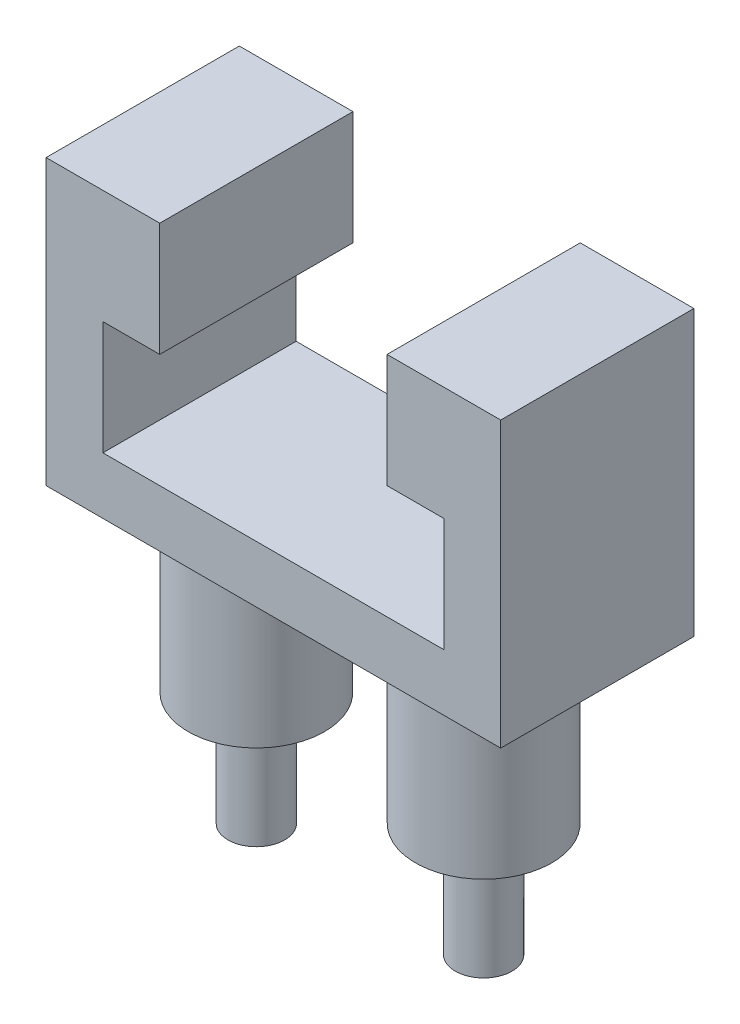
ISO-10303-21;
HEADER;
FILE_DESCRIPTION(('STEP AP214'),'2;1');
FILE_NAME('part.step','',(''),(''),'','','');
FILE_SCHEMA(('AUTOMOTIVE_DESIGN { 1 0 10303 214 1 1 1 1 }'));
ENDSEC;
DATA;
#1=APPLICATION_CONTEXT('core data for automotive mechanical design processes');
#2=APPLICATION_PROTOCOL_DEFINITION('international standard','automotive_design',2000,#1);
#3=PRODUCT_CONTEXT('',#1,'mechanical');
#4=PRODUCT('Part','Part','',(#3));
#5=PRODUCT_RELATED_PRODUCT_CATEGORY('part','',(#4));
#6=PRODUCT_DEFINITION_FORMATION('','',#4);
#7=PRODUCT_DEFINITION_CONTEXT('part definition',#1,'design');
#8=PRODUCT_DEFINITION('design','',#6,#7);
#9=PRODUCT_DEFINITION_SHAPE('','',#8);
#10=(LENGTH_UNIT() NAMED_UNIT(*) SI_UNIT(.MILLI.,.METRE.));
#11=(NAMED_UNIT(*) PLANE_ANGLE_UNIT() SI_UNIT($,.RADIAN.));
#12=(NAMED_UNIT(*) SI_UNIT($,.STERADIAN.) SOLID_ANGLE_UNIT());
#13=UNCERTAINTY_MEASURE_WITH_UNIT(LENGTH_MEASURE(1.E-05),#10,'distance_accuracy_value','');
#14=(GEOMETRIC_REPRESENTATION_CONTEXT(3) GLOBAL_UNCERTAINTY_ASSIGNED_CONTEXT((#13)) GLOBAL_UNIT_ASSIGNED_CONTEXT((#10,
#11,#12)) REPRESENTATION_CONTEXT('',''));
#15=CARTESIAN_POINT('',(0.,0.,0.));
#16=DIRECTION('',(0.,0.,1.));
#17=DIRECTION('',(1.,0.,0.));
#18=AXIS2_PLACEMENT_3D('',#15,#16,#17);
#19=CARTESIAN_POINT('',(26.,-20.,-6.));
#20=DIRECTION('',(0.,1.,0.));
#21=DIRECTION('',(0.,0.,1.));
#22=AXIS2_PLACEMENT_3D('',#19,#20,#21);
#23=CYLINDRICAL_SURFACE('',#22,6.);
#24=CARTESIAN_POINT('',(26.,0.,-6.));
#25=DIRECTION('',(0.,-1.,0.));
#26=DIRECTION('',(0.,0.,-1.));
#27=AXIS2_PLACEMENT_3D('',#24,#25,#26);
#28=CIRCLE('',#27,6.);
#29=CARTESIAN_POINT('',(26.,0.,-12.));
#30=VERTEX_POINT('',#29);
#31=EDGE_CURVE('E237',#30,#30,#28,.T.);
#32=ORIENTED_EDGE('',*,*,#31,.T.);
#33=EDGE_LOOP('',(#32));
#34=FACE_BOUND('',#33,.T.);
#35=CARTESIAN_POINT('',(26.,-15.,-6.));
#36=DIRECTION('',(0.,-1.,0.));
#37=DIRECTION('',(0.,0.,-1.));
#38=AXIS2_PLACEMENT_3D('',#35,#36,#37);
#39=CIRCLE('',#38,5.99999999999999);
#40=CARTESIAN_POINT('',(26.,-15.,-12.));
#41=VERTEX_POINT('',#40);
#42=EDGE_CURVE('E226',#41,#41,#39,.T.);
#43=ORIENTED_EDGE('',*,*,#42,.F.);
#44=EDGE_LOOP('',(#43));
#45=FACE_BOUND('',#44,.T.);
#46=ADVANCED_FACE('F48',(#34,#45),#23,.T.);
#47=CARTESIAN_POINT('',(6.,-20.,-6.));
#48=DIRECTION('',(0.,1.,0.));
#49=DIRECTION('',(0.,0.,1.));
#50=AXIS2_PLACEMENT_3D('',#47,#48,#49);
#51=CYLINDRICAL_SURFACE('',#50,6.);
#52=CARTESIAN_POINT('',(6.,0.,-6.));
#53=DIRECTION('',(0.,-1.,0.));
#54=DIRECTION('',(0.,0.,-1.));
#55=AXIS2_PLACEMENT_3D('',#52,#53,#54);
#56=CIRCLE('',#55,6.);
#57=CARTESIAN_POINT('',(6.,0.,-12.));
#58=VERTEX_POINT('',#57);
#59=EDGE_CURVE('E240',#58,#58,#56,.T.);
#60=ORIENTED_EDGE('',*,*,#59,.T.);
#61=EDGE_LOOP('',(#60));
#62=FACE_BOUND('',#61,.T.);
#63=CARTESIAN_POINT('',(6.,-15.,-6.));
#64=DIRECTION('',(0.,-1.,0.));
#65=DIRECTION('',(0.,0.,-1.));
#66=AXIS2_PLACEMENT_3D('',#63,#64,#65);
#67=CIRCLE('',#66,6.);
#68=CARTESIAN_POINT('',(6.,-15.,-12.));
#69=VERTEX_POINT('',#68);
#70=EDGE_CURVE('E233',#69,#69,#67,.T.);
#71=ORIENTED_EDGE('',*,*,#70,.F.);
#72=EDGE_LOOP('',(#71));
#73=FACE_BOUND('',#72,.T.);
#74=ADVANCED_FACE('F300',(#62,#73),#51,.T.);
#75=CARTESIAN_POINT('',(0.,25.,0.));
#76=DIRECTION('',(0.,1.,0.));
#77=DIRECTION('',(0.,0.,1.));
#78=AXIS2_PLACEMENT_3D('',#75,#76,#77);
#79=PLANE('',#78);
#80=DIRECTION('',(0.,0.,1.));
#81=VECTOR('',#80,1.);
#82=CARTESIAN_POINT('',(-4.,25.,-12.));
#83=LINE('',#82,#81);
#84=CARTESIAN_POINT('',(-4.,25.,-14.5));
#85=VERTEX_POINT('',#84);
#86=CARTESIAN_POINT('',(-4.,25.,2.5));
#87=VERTEX_POINT('',#86);
#88=EDGE_CURVE('E52',#85,#87,#83,.T.);
#89=ORIENTED_EDGE('',*,*,#88,.T.);
#90=DIRECTION('',(-1.,0.,0.));
#91=VECTOR('',#90,1.);
#92=CARTESIAN_POINT('',(-4.,25.,2.5));
#93=LINE('',#92,#91);
#94=CARTESIAN_POINT('',(6.,25.,2.5));
#95=VERTEX_POINT('',#94);
#96=EDGE_CURVE('E220',#95,#87,#93,.T.);
#97=ORIENTED_EDGE('',*,*,#96,.F.);
#98=DIRECTION('',(0.,0.,-1.));
#99=VECTOR('',#98,1.);
#100=CARTESIAN_POINT('',(6.,25.,76.7402273908541));
#101=LINE('',#100,#99);
#102=CARTESIAN_POINT('',(6.,25.,-14.5));
#103=VERTEX_POINT('',#102);
#104=EDGE_CURVE('E72',#95,#103,#101,.T.);
#105=ORIENTED_EDGE('',*,*,#104,.T.);
#106=DIRECTION('',(1.,0.,0.));
#107=VECTOR('',#106,1.);
#108=CARTESIAN_POINT('',(6.,25.,-14.5));
#109=LINE('',#108,#107);
#110=EDGE_CURVE('E167',#85,#103,#109,.T.);
#111=ORIENTED_EDGE('',*,*,#110,.F.);
#112=EDGE_LOOP('',(#89,#97,#105,#111));
#113=FACE_BOUND('',#112,.T.);
#114=ADVANCED_FACE('F263',(#113),#79,.T.);
#115=CARTESIAN_POINT('',(0.,0.,0.));
#116=DIRECTION('',(0.,-1.,0.));
#117=DIRECTION('',(0.,0.,-1.));
#118=AXIS2_PLACEMENT_3D('',#115,#116,#117);
#119=PLANE('',#118);
#120=ORIENTED_EDGE('',*,*,#31,.F.);
#121=EDGE_LOOP('',(#120));
#122=FACE_BOUND('',#121,.T.);
#123=ORIENTED_EDGE('',*,*,#59,.F.);
#124=EDGE_LOOP('',(#123));
#125=FACE_BOUND('',#124,.T.);
#126=DIRECTION('',(0.,0.,1.));
#127=VECTOR('',#126,1.);
#128=CARTESIAN_POINT('',(36.,0.,-12.));
#129=LINE('',#128,#127);
#130=CARTESIAN_POINT('',(36.,0.,-14.5));
#131=VERTEX_POINT('',#130);
#132=CARTESIAN_POINT('',(36.,0.,2.5));
#133=VERTEX_POINT('',#132);
#134=EDGE_CURVE('E140',#131,#133,#129,.T.);
#135=ORIENTED_EDGE('',*,*,#134,.T.);
#136=DIRECTION('',(1.,0.,0.));
#137=VECTOR('',#136,1.);
#138=CARTESIAN_POINT('',(36.,0.,2.5));
#139=LINE('',#138,#137);
#140=CARTESIAN_POINT('',(-4.,0.,2.5));
#141=VERTEX_POINT('',#140);
#142=EDGE_CURVE('E194',#141,#133,#139,.T.);
#143=ORIENTED_EDGE('',*,*,#142,.F.);
#144=DIRECTION('',(0.,0.,1.));
#145=VECTOR('',#144,1.);
#146=CARTESIAN_POINT('',(-4.,0.,-12.));
#147=LINE('',#146,#145);
#148=CARTESIAN_POINT('',(-4.,0.,-14.5));
#149=VERTEX_POINT('',#148);
#150=EDGE_CURVE('E57',#149,#141,#147,.T.);
#151=ORIENTED_EDGE('',*,*,#150,.F.);
#152=DIRECTION('',(-1.,0.,0.));
#153=VECTOR('',#152,1.);
#154=CARTESIAN_POINT('',(-4.,0.,-14.5));
#155=LINE('',#154,#153);
#156=EDGE_CURVE('E153',#131,#149,#155,.T.);
#157=ORIENTED_EDGE('',*,*,#156,.F.);
#158=EDGE_LOOP('',(#135,#143,#151,#157));
#159=FACE_BOUND('',#158,.T.);
#160=ADVANCED_FACE('F50',(#122,#125,#159),#119,.T.);
#161=DIRECTION('',(0.,0.,-1.));
#162=VECTOR('',#161,1.);
#163=CARTESIAN_POINT('',(26.,25.,76.7402273908541));
#164=LINE('',#163,#162);
#165=CARTESIAN_POINT('',(26.,25.,2.5));
#166=VERTEX_POINT('',#165);
#167=CARTESIAN_POINT('',(26.,25.,-14.5));
#168=VERTEX_POINT('',#167);
#169=EDGE_CURVE('E243',#166,#168,#164,.T.);
#170=ORIENTED_EDGE('',*,*,#169,.F.);
#171=DIRECTION('',(-1.,0.,0.));
#172=VECTOR('',#171,1.);
#173=CARTESIAN_POINT('',(26.,25.,2.5));
#174=LINE('',#173,#172);
#175=CARTESIAN_POINT('',(36.,25.,2.5));
#176=VERTEX_POINT('',#175);
#177=EDGE_CURVE('E197',#176,#166,#174,.T.);
#178=ORIENTED_EDGE('',*,*,#177,.F.);
#179=DIRECTION('',(0.,0.,1.));
#180=VECTOR('',#179,1.);
#181=CARTESIAN_POINT('',(36.,25.,-12.));
#182=LINE('',#181,#180);
#183=CARTESIAN_POINT('',(36.,25.,-14.5));
#184=VERTEX_POINT('',#183);
#185=EDGE_CURVE('E150',#184,#176,#182,.T.);
#186=ORIENTED_EDGE('',*,*,#185,.F.);
#187=DIRECTION('',(1.,0.,0.));
#188=VECTOR('',#187,1.);
#189=CARTESIAN_POINT('',(36.,25.,-14.5));
#190=LINE('',#189,#188);
#191=EDGE_CURVE('E163',#168,#184,#190,.T.);
#192=ORIENTED_EDGE('',*,*,#191,.F.);
#193=EDGE_LOOP('',(#170,#178,#186,#192));
#194=FACE_BOUND('',#193,.T.);
#195=ADVANCED_FACE('F291',(#194),#79,.T.);
#196=CARTESIAN_POINT('',(-4.,0.,-12.));
#197=DIRECTION('',(1.,0.,0.));
#198=DIRECTION('',(0.,0.,-1.));
#199=AXIS2_PLACEMENT_3D('',#196,#197,#198);
#200=PLANE('',#199);
#201=ORIENTED_EDGE('',*,*,#150,.T.);
#202=DIRECTION('',(0.,-1.,0.));
#203=VECTOR('',#202,1.);
#204=CARTESIAN_POINT('',(-4.,0.,2.5));
#205=LINE('',#204,#203);
#206=EDGE_CURVE('E191',#87,#141,#205,.T.);
#207=ORIENTED_EDGE('',*,*,#206,.F.);
#208=ORIENTED_EDGE('',*,*,#88,.F.);
#209=DIRECTION('',(0.,1.,0.));
#210=VECTOR('',#209,1.);
#211=CARTESIAN_POINT('',(-4.,25.,-14.5));
#212=LINE('',#211,#210);
#213=EDGE_CURVE('E157',#149,#85,#212,.T.);
#214=ORIENTED_EDGE('',*,*,#213,.F.);
#215=EDGE_LOOP('',(#201,#207,#208,#214));
#216=FACE_BOUND('',#215,.T.);
#217=ADVANCED_FACE('F260',(#216),#200,.F.);
#218=CARTESIAN_POINT('',(36.,0.,-12.));
#219=DIRECTION('',(1.,0.,0.));
#220=DIRECTION('',(0.,0.,-1.));
#221=AXIS2_PLACEMENT_3D('',#218,#219,#220);
#222=PLANE('',#221);
#223=ORIENTED_EDGE('',*,*,#185,.T.);
#224=DIRECTION('',(0.,1.,0.));
#225=VECTOR('',#224,1.);
#226=CARTESIAN_POINT('',(36.,25.,2.5));
#227=LINE('',#226,#225);
#228=EDGE_CURVE('E146',#133,#176,#227,.T.);
#229=ORIENTED_EDGE('',*,*,#228,.F.);
#230=ORIENTED_EDGE('',*,*,#134,.F.);
#231=DIRECTION('',(0.,-1.,0.));
#232=VECTOR('',#231,1.);
#233=CARTESIAN_POINT('',(36.,0.,-14.5));
#234=LINE('',#233,#232);
#235=EDGE_CURVE('E144',#184,#131,#234,.T.);
#236=ORIENTED_EDGE('',*,*,#235,.F.);
#237=EDGE_LOOP('',(#223,#229,#230,#236));
#238=FACE_BOUND('',#237,.T.);
#239=ADVANCED_FACE('F142',(#238),#222,.T.);
#240=CARTESIAN_POINT('',(6.,15.,76.7402273908541));
#241=DIRECTION('',(-1.,0.,0.));
#242=DIRECTION('',(0.,0.,1.));
#243=AXIS2_PLACEMENT_3D('',#240,#241,#242);
#244=PLANE('',#243);
#245=ORIENTED_EDGE('',*,*,#104,.F.);
#246=DIRECTION('',(0.,1.,0.));
#247=VECTOR('',#246,1.);
#248=CARTESIAN_POINT('',(6.,25.,2.5));
#249=LINE('',#248,#247);
#250=CARTESIAN_POINT('',(6.,15.,2.5));
#251=VERTEX_POINT('',#250);
#252=EDGE_CURVE('E218',#251,#95,#249,.T.);
#253=ORIENTED_EDGE('',*,*,#252,.F.);
#254=DIRECTION('',(0.,0.,-1.));
#255=VECTOR('',#254,1.);
#256=CARTESIAN_POINT('',(6.,15.,76.7402273908541));
#257=LINE('',#256,#255);
#258=CARTESIAN_POINT('',(6.,15.,-14.5));
#259=VERTEX_POINT('',#258);
#260=EDGE_CURVE('E256',#251,#259,#257,.T.);
#261=ORIENTED_EDGE('',*,*,#260,.T.);
#262=DIRECTION('',(0.,-1.,0.));
#263=VECTOR('',#262,1.);
#264=CARTESIAN_POINT('',(6.,15.,-14.5));
#265=LINE('',#264,#263);
#266=EDGE_CURVE('E170',#103,#259,#265,.T.);
#267=ORIENTED_EDGE('',*,*,#266,.F.);
#268=EDGE_LOOP('',(#245,#253,#261,#267));
#269=FACE_BOUND('',#268,.T.);
#270=ADVANCED_FACE('F265',(#269),#244,.F.);
#271=CARTESIAN_POINT('',(0.999999999999999,15.,76.7402273908541));
#272=DIRECTION('',(0.,1.,0.));
#273=DIRECTION('',(0.,0.,1.));
#274=AXIS2_PLACEMENT_3D('',#271,#272,#273);
#275=PLANE('',#274);
#276=ORIENTED_EDGE('',*,*,#260,.F.);
#277=DIRECTION('',(1.,0.,0.));
#278=VECTOR('',#277,1.);
#279=CARTESIAN_POINT('',(6.,15.,2.5));
#280=LINE('',#279,#278);
#281=CARTESIAN_POINT('',(0.999999999999999,15.,2.5));
#282=VERTEX_POINT('',#281);
#283=EDGE_CURVE('E215',#282,#251,#280,.T.);
#284=ORIENTED_EDGE('',*,*,#283,.F.);
#285=DIRECTION('',(0.,0.,-1.));
#286=VECTOR('',#285,1.);
#287=CARTESIAN_POINT('',(0.999999999999999,15.,76.7402273908541));
#288=LINE('',#287,#286);
#289=CARTESIAN_POINT('',(0.999999999999999,15.,-14.5));
#290=VERTEX_POINT('',#289);
#291=EDGE_CURVE('E253',#282,#290,#288,.T.);
#292=ORIENTED_EDGE('',*,*,#291,.T.);
#293=DIRECTION('',(-1.,0.,0.));
#294=VECTOR('',#293,1.);
#295=CARTESIAN_POINT('',(0.999999999999999,15.,-14.5));
#296=LINE('',#295,#294);
#297=EDGE_CURVE('E173',#259,#290,#296,.T.);
#298=ORIENTED_EDGE('',*,*,#297,.F.);
#299=EDGE_LOOP('',(#276,#284,#292,#298));
#300=FACE_BOUND('',#299,.T.);
#301=ADVANCED_FACE('F268',(#300),#275,.F.);
#302=CARTESIAN_POINT('',(0.999999999999999,5.,76.7402273908541));
#303=DIRECTION('',(-1.,0.,0.));
#304=DIRECTION('',(0.,0.,1.));
#305=AXIS2_PLACEMENT_3D('',#302,#303,#304);
#306=PLANE('',#305);
#307=ORIENTED_EDGE('',*,*,#291,.F.);
#308=DIRECTION('',(0.,1.,0.));
#309=VECTOR('',#308,1.);
#310=CARTESIAN_POINT('',(0.999999999999999,15.,2.5));
#311=LINE('',#310,#309);
#312=CARTESIAN_POINT('',(0.999999999999999,5.,2.5));
#313=VERTEX_POINT('',#312);
#314=EDGE_CURVE('E212',#313,#282,#311,.T.);
#315=ORIENTED_EDGE('',*,*,#314,.F.);
#316=DIRECTION('',(0.,0.,-1.));
#317=VECTOR('',#316,1.);
#318=CARTESIAN_POINT('',(0.999999999999999,5.,76.7402273908541));
#319=LINE('',#318,#317);
#320=CARTESIAN_POINT('',(0.999999999999999,5.,-14.5));
#321=VERTEX_POINT('',#320);
#322=EDGE_CURVE('E251',#313,#321,#319,.T.);
#323=ORIENTED_EDGE('',*,*,#322,.T.);
#324=DIRECTION('',(0.,-1.,0.));
#325=VECTOR('',#324,1.);
#326=CARTESIAN_POINT('',(0.999999999999999,5.,-14.5));
#327=LINE('',#326,#325);
#328=EDGE_CURVE('E176',#290,#321,#327,.T.);
#329=ORIENTED_EDGE('',*,*,#328,.F.);
#330=EDGE_LOOP('',(#307,#315,#323,#329));
#331=FACE_BOUND('',#330,.T.);
#332=ADVANCED_FACE('F272',(#331),#306,.F.);
#333=CARTESIAN_POINT('',(0.999999999999999,5.,76.7402273908541));
#334=DIRECTION('',(0.,-1.,0.));
#335=DIRECTION('',(0.,0.,-1.));
#336=AXIS2_PLACEMENT_3D('',#333,#334,#335);
#337=PLANE('',#336);
#338=ORIENTED_EDGE('',*,*,#322,.F.);
#339=DIRECTION('',(-1.,0.,0.));
#340=VECTOR('',#339,1.);
#341=CARTESIAN_POINT('',(0.999999999999999,5.,2.5));
#342=LINE('',#341,#340);
#343=CARTESIAN_POINT('',(31.,5.,2.5));
#344=VERTEX_POINT('',#343);
#345=EDGE_CURVE('E209',#344,#313,#342,.T.);
#346=ORIENTED_EDGE('',*,*,#345,.F.);
#347=DIRECTION('',(0.,0.,-1.));
#348=VECTOR('',#347,1.);
#349=CARTESIAN_POINT('',(31.,5.,76.7402273908541));
#350=LINE('',#349,#348);
#351=CARTESIAN_POINT('',(31.,5.,-14.5));
#352=VERTEX_POINT('',#351);
#353=EDGE_CURVE('E249',#344,#352,#350,.T.);
#354=ORIENTED_EDGE('',*,*,#353,.T.);
#355=DIRECTION('',(1.,0.,0.));
#356=VECTOR('',#355,1.);
#357=CARTESIAN_POINT('',(31.,5.,-14.5));
#358=LINE('',#357,#356);
#359=EDGE_CURVE('E179',#321,#352,#358,.T.);
#360=ORIENTED_EDGE('',*,*,#359,.F.);
#361=EDGE_LOOP('',(#338,#346,#354,#360));
#362=FACE_BOUND('',#361,.T.);
#363=ADVANCED_FACE('F277',(#362),#337,.F.);
#364=CARTESIAN_POINT('',(31.,5.,76.7402273908541));
#365=DIRECTION('',(1.,0.,0.));
#366=DIRECTION('',(0.,0.,-1.));
#367=AXIS2_PLACEMENT_3D('',#364,#365,#366);
#368=PLANE('',#367);
#369=ORIENTED_EDGE('',*,*,#353,.F.);
#370=DIRECTION('',(0.,-1.,0.));
#371=VECTOR('',#370,1.);
#372=CARTESIAN_POINT('',(31.,5.,2.5));
#373=LINE('',#372,#371);
#374=CARTESIAN_POINT('',(31.,15.,2.5));
#375=VERTEX_POINT('',#374);
#376=EDGE_CURVE('E206',#375,#344,#373,.T.);
#377=ORIENTED_EDGE('',*,*,#376,.F.);
#378=DIRECTION('',(0.,0.,-1.));
#379=VECTOR('',#378,1.);
#380=CARTESIAN_POINT('',(31.,15.,76.7402273908541));
#381=LINE('',#380,#379);
#382=CARTESIAN_POINT('',(31.,15.,-14.5));
#383=VERTEX_POINT('',#382);
#384=EDGE_CURVE('E247',#375,#383,#381,.T.);
#385=ORIENTED_EDGE('',*,*,#384,.T.);
#386=DIRECTION('',(0.,1.,0.));
#387=VECTOR('',#386,1.);
#388=CARTESIAN_POINT('',(31.,15.,-14.5));
#389=LINE('',#388,#387);
#390=EDGE_CURVE('E182',#352,#383,#389,.T.);
#391=ORIENTED_EDGE('',*,*,#390,.F.);
#392=EDGE_LOOP('',(#369,#377,#385,#391));
#393=FACE_BOUND('',#392,.T.);
#394=ADVANCED_FACE('F280',(#393),#368,.F.);
#395=CARTESIAN_POINT('',(31.,15.,76.7402273908541));
#396=DIRECTION('',(0.,1.,0.));
#397=DIRECTION('',(0.,0.,1.));
#398=AXIS2_PLACEMENT_3D('',#395,#396,#397);
#399=PLANE('',#398);
#400=ORIENTED_EDGE('',*,*,#384,.F.);
#401=DIRECTION('',(1.,0.,0.));
#402=VECTOR('',#401,1.);
#403=CARTESIAN_POINT('',(31.,15.,2.5));
#404=LINE('',#403,#402);
#405=CARTESIAN_POINT('',(26.,15.,2.5));
#406=VERTEX_POINT('',#405);
#407=EDGE_CURVE('E203',#406,#375,#404,.T.);
#408=ORIENTED_EDGE('',*,*,#407,.F.);
#409=DIRECTION('',(0.,0.,-1.));
#410=VECTOR('',#409,1.);
#411=CARTESIAN_POINT('',(26.,15.,76.7402273908541));
#412=LINE('',#411,#410);
#413=CARTESIAN_POINT('',(26.,15.,-14.5));
#414=VERTEX_POINT('',#413);
#415=EDGE_CURVE('E245',#406,#414,#412,.T.);
#416=ORIENTED_EDGE('',*,*,#415,.T.);
#417=DIRECTION('',(-1.,0.,0.));
#418=VECTOR('',#417,1.);
#419=CARTESIAN_POINT('',(26.,15.,-14.5));
#420=LINE('',#419,#418);
#421=EDGE_CURVE('E185',#383,#414,#420,.T.);
#422=ORIENTED_EDGE('',*,*,#421,.F.);
#423=EDGE_LOOP('',(#400,#408,#416,#422));
#424=FACE_BOUND('',#423,.T.);
#425=ADVANCED_FACE('F284',(#424),#399,.F.);
#426=CARTESIAN_POINT('',(26.,15.,76.7402273908541));
#427=DIRECTION('',(1.,0.,0.));
#428=DIRECTION('',(0.,0.,-1.));
#429=AXIS2_PLACEMENT_3D('',#426,#427,#428);
#430=PLANE('',#429);
#431=ORIENTED_EDGE('',*,*,#415,.F.);
#432=DIRECTION('',(0.,-1.,0.));
#433=VECTOR('',#432,1.);
#434=CARTESIAN_POINT('',(26.,15.,2.5));
#435=LINE('',#434,#433);
#436=EDGE_CURVE('E200',#166,#406,#435,.T.);
#437=ORIENTED_EDGE('',*,*,#436,.F.);
#438=ORIENTED_EDGE('',*,*,#169,.T.);
#439=DIRECTION('',(0.,1.,0.));
#440=VECTOR('',#439,1.);
#441=CARTESIAN_POINT('',(26.,25.,-14.5));
#442=LINE('',#441,#440);
#443=EDGE_CURVE('E188',#414,#168,#442,.T.);
#444=ORIENTED_EDGE('',*,*,#443,.F.);
#445=EDGE_LOOP('',(#431,#437,#438,#444));
#446=FACE_BOUND('',#445,.T.);
#447=ADVANCED_FACE('F288',(#446),#430,.F.);
#448=CARTESIAN_POINT('',(6.,-15.,-6.));
#449=DIRECTION('',(0.,-1.,0.));
#450=DIRECTION('',(0.,0.,-1.));
#451=AXIS2_PLACEMENT_3D('',#448,#449,#450);
#452=PLANE('',#451);
#453=CARTESIAN_POINT('',(6.,-15.,-6.));
#454=DIRECTION('',(0.,-1.,0.));
#455=DIRECTION('',(0.,0.,-1.));
#456=AXIS2_PLACEMENT_3D('',#453,#454,#455);
#457=CIRCLE('',#456,2.5);
#458=CARTESIAN_POINT('',(6.,-15.,-8.5));
#459=VERTEX_POINT('',#458);
#460=EDGE_CURVE('E12',#459,#459,#457,.T.);
#461=ORIENTED_EDGE('',*,*,#460,.F.);
#462=EDGE_LOOP('',(#461));
#463=FACE_BOUND('',#462,.T.);
#464=ORIENTED_EDGE('',*,*,#70,.T.);
#465=EDGE_LOOP('',(#464));
#466=FACE_BOUND('',#465,.T.);
#467=ADVANCED_FACE('F317',(#463,#466),#452,.T.);
#468=CARTESIAN_POINT('',(6.,-25.,-6.));
#469=DIRECTION('',(0.,1.,0.));
#470=DIRECTION('',(0.,0.,1.));
#471=AXIS2_PLACEMENT_3D('',#468,#469,#470);
#472=CYLINDRICAL_SURFACE('',#471,2.5);
#473=CARTESIAN_POINT('',(6.,-25.,-6.));
#474=DIRECTION('',(0.,-1.,0.));
#475=DIRECTION('',(0.,0.,-1.));
#476=AXIS2_PLACEMENT_3D('',#473,#474,#475);
#477=CIRCLE('',#476,2.5);
#478=CARTESIAN_POINT('',(6.,-25.,-8.5));
#479=VERTEX_POINT('',#478);
#480=EDGE_CURVE('E229',#479,#479,#477,.T.);
#481=ORIENTED_EDGE('',*,*,#480,.F.);
#482=EDGE_LOOP('',(#481));
#483=FACE_BOUND('',#482,.T.);
#484=ORIENTED_EDGE('',*,*,#460,.T.);
#485=EDGE_LOOP('',(#484));
#486=FACE_BOUND('',#485,.T.);
#487=ADVANCED_FACE('F431',(#483,#486),#472,.T.);
#488=CARTESIAN_POINT('',(6.,-25.,-6.));
#489=DIRECTION('',(0.,-1.,0.));
#490=DIRECTION('',(0.,0.,-1.));
#491=AXIS2_PLACEMENT_3D('',#488,#489,#490);
#492=PLANE('',#491);
#493=ORIENTED_EDGE('',*,*,#480,.T.);
#494=EDGE_LOOP('',(#493));
#495=FACE_BOUND('',#494,.T.);
#496=ADVANCED_FACE('F406',(#495),#492,.T.);
#497=CARTESIAN_POINT('',(26.,-15.,-6.));
#498=DIRECTION('',(0.,-1.,0.));
#499=DIRECTION('',(0.,0.,-1.));
#500=AXIS2_PLACEMENT_3D('',#497,#498,#499);
#501=CYLINDRICAL_SURFACE('',#500,2.5);
#502=CARTESIAN_POINT('',(26.,-15.,-6.));
#503=DIRECTION('',(0.,-1.,0.));
#504=DIRECTION('',(0.,0.,-1.));
#505=AXIS2_PLACEMENT_3D('',#502,#503,#504);
#506=CIRCLE('',#505,2.5);
#507=CARTESIAN_POINT('',(26.,-15.,-8.5));
#508=VERTEX_POINT('',#507);
#509=EDGE_CURVE('E223',#508,#508,#506,.T.);
#510=ORIENTED_EDGE('',*,*,#509,.T.);
#511=EDGE_LOOP('',(#510));
#512=FACE_BOUND('',#511,.T.);
#513=CARTESIAN_POINT('',(26.,-25.,-6.));
#514=DIRECTION('',(0.,-1.,0.));
#515=DIRECTION('',(0.,0.,-1.));
#516=AXIS2_PLACEMENT_3D('',#513,#514,#515);
#517=CIRCLE('',#516,2.5);
#518=CARTESIAN_POINT('',(26.,-25.,-8.5));
#519=VERTEX_POINT('',#518);
#520=EDGE_CURVE('E222',#519,#519,#517,.T.);
#521=ORIENTED_EDGE('',*,*,#520,.F.);
#522=EDGE_LOOP('',(#521));
#523=FACE_BOUND('',#522,.T.);
#524=ADVANCED_FACE('F396',(#512,#523),#501,.T.);
#525=CARTESIAN_POINT('',(0.,-15.,0.));
#526=DIRECTION('',(0.,-1.,0.));
#527=DIRECTION('',(0.,0.,-1.));
#528=AXIS2_PLACEMENT_3D('',#525,#526,#527);
#529=PLANE('',#528);
#530=ORIENTED_EDGE('',*,*,#509,.F.);
#531=EDGE_LOOP('',(#530));
#532=FACE_BOUND('',#531,.T.);
#533=ORIENTED_EDGE('',*,*,#42,.T.);
#534=EDGE_LOOP('',(#533));
#535=FACE_BOUND('',#534,.T.);
#536=ADVANCED_FACE('F391',(#532,#535),#529,.T.);
#537=CARTESIAN_POINT('',(26.,-25.,-6.));
#538=DIRECTION('',(0.,-1.,0.));
#539=DIRECTION('',(0.,0.,-1.));
#540=AXIS2_PLACEMENT_3D('',#537,#538,#539);
#541=PLANE('',#540);
#542=ORIENTED_EDGE('',*,*,#520,.T.);
#543=EDGE_LOOP('',(#542));
#544=FACE_BOUND('',#543,.T.);
#545=ADVANCED_FACE('F312',(#544),#541,.T.);
#546=CARTESIAN_POINT('',(0.,0.,2.5));
#547=DIRECTION('',(0.,0.,-1.));
#548=DIRECTION('',(-1.,0.,0.));
#549=AXIS2_PLACEMENT_3D('',#546,#547,#548);
#550=PLANE('',#549);
#551=ORIENTED_EDGE('',*,*,#206,.T.);
#552=ORIENTED_EDGE('',*,*,#142,.T.);
#553=ORIENTED_EDGE('',*,*,#228,.T.);
#554=ORIENTED_EDGE('',*,*,#177,.T.);
#555=ORIENTED_EDGE('',*,*,#436,.T.);
#556=ORIENTED_EDGE('',*,*,#407,.T.);
#557=ORIENTED_EDGE('',*,*,#376,.T.);
#558=ORIENTED_EDGE('',*,*,#345,.T.);
#559=ORIENTED_EDGE('',*,*,#314,.T.);
#560=ORIENTED_EDGE('',*,*,#283,.T.);
#561=ORIENTED_EDGE('',*,*,#252,.T.);
#562=ORIENTED_EDGE('',*,*,#96,.T.);
#563=EDGE_LOOP('',(#551,#552,#553,#554,#555,#556,#557,#558,#559,#560,#561,#562));
#564=FACE_BOUND('',#563,.T.);
#565=ADVANCED_FACE('F262',(#564),#550,.F.);
#566=CARTESIAN_POINT('',(0.,0.,-14.5));
#567=DIRECTION('',(0.,0.,1.));
#568=DIRECTION('',(1.,0.,0.));
#569=AXIS2_PLACEMENT_3D('',#566,#567,#568);
#570=PLANE('',#569);
#571=ORIENTED_EDGE('',*,*,#235,.T.);
#572=ORIENTED_EDGE('',*,*,#156,.T.);
#573=ORIENTED_EDGE('',*,*,#213,.T.);
#574=ORIENTED_EDGE('',*,*,#110,.T.);
#575=ORIENTED_EDGE('',*,*,#266,.T.);
#576=ORIENTED_EDGE('',*,*,#297,.T.);
#577=ORIENTED_EDGE('',*,*,#328,.T.);
#578=ORIENTED_EDGE('',*,*,#359,.T.);
#579=ORIENTED_EDGE('',*,*,#390,.T.);
#580=ORIENTED_EDGE('',*,*,#421,.T.);
#581=ORIENTED_EDGE('',*,*,#443,.T.);
#582=ORIENTED_EDGE('',*,*,#191,.T.);
#583=EDGE_LOOP('',(#571,#572,#573,#574,#575,#576,#577,#578,#579,#580,#581,#582));
#584=FACE_BOUND('',#583,.T.);
#585=ADVANCED_FACE('F160',(#584),#570,.F.);
#586=CLOSED_SHELL('',(#46,#74,#114,#160,#195,#217,#239,#270,#301,#332,#363,#394,#425,#447,#467,
#487,#496,#524,#536,#545,#565,#585));
#587=MANIFOLD_SOLID_BREP('B2',#586);
#588=ADVANCED_BREP_SHAPE_REPRESENTATION('',(#18,#587),#14);
#589=SHAPE_DEFINITION_REPRESENTATION(#9,#588);
ENDSEC;
END-ISO-10303-21;
